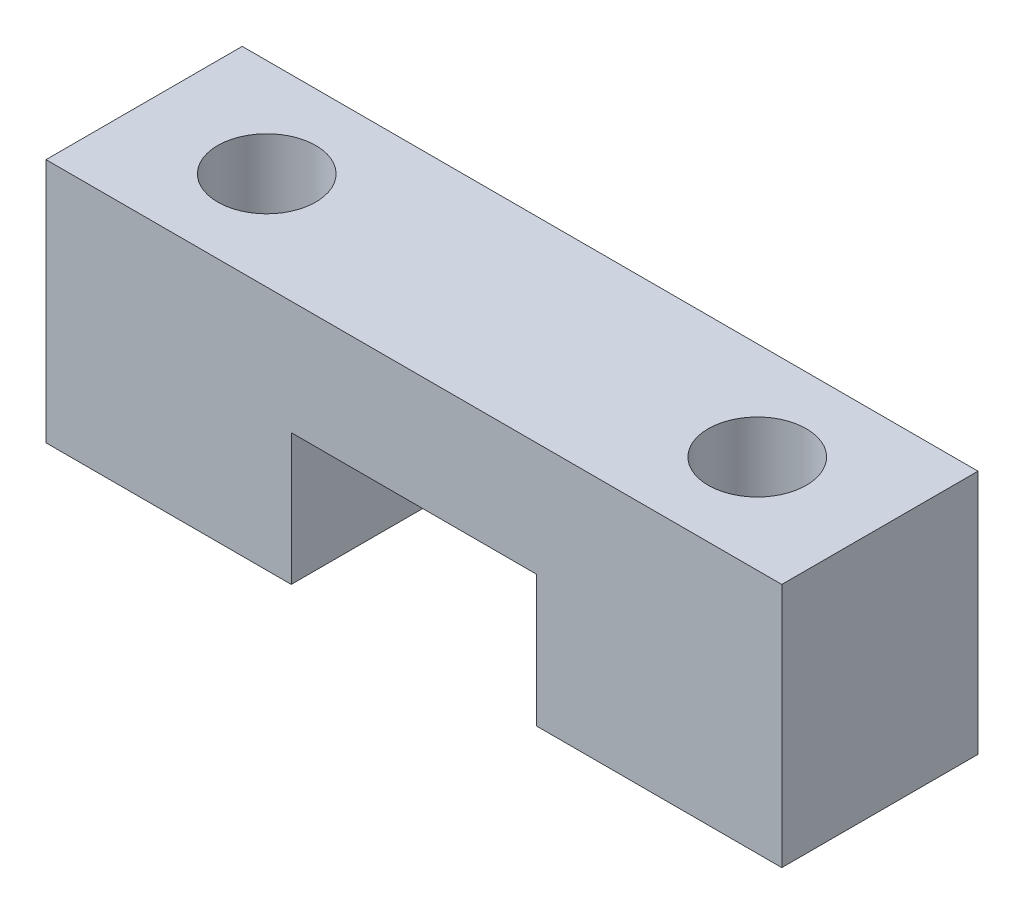
ISO-10303-21;
HEADER;
FILE_DESCRIPTION(('STEP AP214'),'2;1');
FILE_NAME('part.step','',(''),(''),'','','');
FILE_SCHEMA(('AUTOMOTIVE_DESIGN { 1 0 10303 214 1 1 1 1 }'));
ENDSEC;
DATA;
#1=APPLICATION_CONTEXT('core data for automotive mechanical design processes');
#2=APPLICATION_PROTOCOL_DEFINITION('international standard','automotive_design',2000,#1);
#3=PRODUCT_CONTEXT('',#1,'mechanical');
#4=PRODUCT('Part','Part','',(#3));
#5=PRODUCT_RELATED_PRODUCT_CATEGORY('part','',(#4));
#6=PRODUCT_DEFINITION_FORMATION('','',#4);
#7=PRODUCT_DEFINITION_CONTEXT('part definition',#1,'design');
#8=PRODUCT_DEFINITION('design','',#6,#7);
#9=PRODUCT_DEFINITION_SHAPE('','',#8);
#10=(LENGTH_UNIT() NAMED_UNIT(*) SI_UNIT(.MILLI.,.METRE.));
#11=(NAMED_UNIT(*) PLANE_ANGLE_UNIT() SI_UNIT($,.RADIAN.));
#12=(NAMED_UNIT(*) SI_UNIT($,.STERADIAN.) SOLID_ANGLE_UNIT());
#13=UNCERTAINTY_MEASURE_WITH_UNIT(LENGTH_MEASURE(1.E-05),#10,'distance_accuracy_value','');
#14=(GEOMETRIC_REPRESENTATION_CONTEXT(3) GLOBAL_UNCERTAINTY_ASSIGNED_CONTEXT((#13)) GLOBAL_UNIT_ASSIGNED_CONTEXT((#10,
#11,#12)) REPRESENTATION_CONTEXT('',''));
#15=CARTESIAN_POINT('',(0.,0.,0.));
#16=DIRECTION('',(0.,0.,1.));
#17=DIRECTION('',(1.,0.,0.));
#18=AXIS2_PLACEMENT_3D('',#15,#16,#17);
#19=CARTESIAN_POINT('',(0.,6.35,5.08));
#20=DIRECTION('',(1.,0.,0.));
#21=DIRECTION('',(0.,0.,-1.));
#22=AXIS2_PLACEMENT_3D('',#19,#20,#21);
#23=PLANE('',#22);
#24=DIRECTION('',(0.,-1.,0.));
#25=VECTOR('',#24,1.);
#26=CARTESIAN_POINT('',(0.,6.35,0.));
#27=LINE('',#26,#25);
#28=CARTESIAN_POINT('',(0.,6.35,0.));
#29=VERTEX_POINT('',#28);
#30=CARTESIAN_POINT('',(0.,0.,0.));
#31=VERTEX_POINT('',#30);
#32=EDGE_CURVE('E140',#29,#31,#27,.T.);
#33=ORIENTED_EDGE('',*,*,#32,.T.);
#34=DIRECTION('',(0.,0.,-1.));
#35=VECTOR('',#34,1.);
#36=CARTESIAN_POINT('',(0.,0.,5.08));
#37=LINE('',#36,#35);
#38=CARTESIAN_POINT('',(0.,0.,5.08));
#39=VERTEX_POINT('',#38);
#40=EDGE_CURVE('E11',#39,#31,#37,.T.);
#41=ORIENTED_EDGE('',*,*,#40,.F.);
#42=DIRECTION('',(0.,-1.,0.));
#43=VECTOR('',#42,1.);
#44=CARTESIAN_POINT('',(0.,6.35,5.08));
#45=LINE('',#44,#43);
#46=CARTESIAN_POINT('',(0.,6.35,5.08));
#47=VERTEX_POINT('',#46);
#48=EDGE_CURVE('E163',#47,#39,#45,.T.);
#49=ORIENTED_EDGE('',*,*,#48,.F.);
#50=DIRECTION('',(0.,0.,-1.));
#51=VECTOR('',#50,1.);
#52=CARTESIAN_POINT('',(0.,6.35,5.08));
#53=LINE('',#52,#51);
#54=EDGE_CURVE('E136',#47,#29,#53,.T.);
#55=ORIENTED_EDGE('',*,*,#54,.T.);
#56=EDGE_LOOP('',(#33,#41,#49,#55));
#57=FACE_BOUND('',#56,.T.);
#58=ADVANCED_FACE('F39',(#57),#23,.F.);
#59=CARTESIAN_POINT('',(0.,0.,5.08));
#60=DIRECTION('',(0.,1.,0.));
#61=DIRECTION('',(0.,0.,1.));
#62=AXIS2_PLACEMENT_3D('',#59,#60,#61);
#63=PLANE('',#62);
#64=CARTESIAN_POINT('',(3.175,0.,2.54));
#65=DIRECTION('',(0.,1.,0.));
#66=DIRECTION('',(-1.,0.,0.));
#67=AXIS2_PLACEMENT_3D('',#64,#65,#66);
#68=CIRCLE('',#67,1.27);
#69=CARTESIAN_POINT('',(1.905,0.,2.54));
#70=VERTEX_POINT('',#69);
#71=EDGE_CURVE('E145',#70,#70,#68,.T.);
#72=ORIENTED_EDGE('',*,*,#71,.T.);
#73=EDGE_LOOP('',(#72));
#74=FACE_BOUND('',#73,.T.);
#75=DIRECTION('',(1.,0.,0.));
#76=VECTOR('',#75,1.);
#77=CARTESIAN_POINT('',(0.,0.,0.));
#78=LINE('',#77,#76);
#79=CARTESIAN_POINT('',(6.35,0.,0.));
#80=VERTEX_POINT('',#79);
#81=EDGE_CURVE('E144',#31,#80,#78,.T.);
#82=ORIENTED_EDGE('',*,*,#81,.T.);
#83=DIRECTION('',(0.,0.,-1.));
#84=VECTOR('',#83,1.);
#85=CARTESIAN_POINT('',(6.35,0.,5.08));
#86=LINE('',#85,#84);
#87=CARTESIAN_POINT('',(6.35,0.,5.08));
#88=VERTEX_POINT('',#87);
#89=EDGE_CURVE('E48',#88,#80,#86,.T.);
#90=ORIENTED_EDGE('',*,*,#89,.F.);
#91=DIRECTION('',(1.,0.,0.));
#92=VECTOR('',#91,1.);
#93=CARTESIAN_POINT('',(0.,0.,5.08));
#94=LINE('',#93,#92);
#95=EDGE_CURVE('E99',#39,#88,#94,.T.);
#96=ORIENTED_EDGE('',*,*,#95,.F.);
#97=ORIENTED_EDGE('',*,*,#40,.T.);
#98=EDGE_LOOP('',(#82,#90,#96,#97));
#99=FACE_BOUND('',#98,.T.);
#100=ADVANCED_FACE('F223',(#74,#99),#63,.F.);
#101=CARTESIAN_POINT('',(6.35,0.,5.08));
#102=DIRECTION('',(-1.,0.,0.));
#103=DIRECTION('',(0.,-1.,0.));
#104=AXIS2_PLACEMENT_3D('',#101,#102,#103);
#105=PLANE('',#104);
#106=DIRECTION('',(0.,1.,0.));
#107=VECTOR('',#106,1.);
#108=CARTESIAN_POINT('',(6.35,0.,0.));
#109=LINE('',#108,#107);
#110=CARTESIAN_POINT('',(6.35,3.4036,0.));
#111=VERTEX_POINT('',#110);
#112=EDGE_CURVE('E148',#80,#111,#109,.T.);
#113=ORIENTED_EDGE('',*,*,#112,.T.);
#114=DIRECTION('',(0.,0.,-1.));
#115=VECTOR('',#114,1.);
#116=CARTESIAN_POINT('',(6.35,3.4036,5.08));
#117=LINE('',#116,#115);
#118=CARTESIAN_POINT('',(6.35,3.4036,5.08));
#119=VERTEX_POINT('',#118);
#120=EDGE_CURVE('E174',#119,#111,#117,.T.);
#121=ORIENTED_EDGE('',*,*,#120,.F.);
#122=DIRECTION('',(0.,1.,0.));
#123=VECTOR('',#122,1.);
#124=CARTESIAN_POINT('',(6.35,0.,5.08));
#125=LINE('',#124,#123);
#126=EDGE_CURVE('E184',#88,#119,#125,.T.);
#127=ORIENTED_EDGE('',*,*,#126,.F.);
#128=ORIENTED_EDGE('',*,*,#89,.T.);
#129=EDGE_LOOP('',(#113,#121,#127,#128));
#130=FACE_BOUND('',#129,.T.);
#131=ADVANCED_FACE('F182',(#130),#105,.F.);
#132=CARTESIAN_POINT('',(6.35,3.4036,5.08));
#133=DIRECTION('',(0.,1.,0.));
#134=DIRECTION('',(0.,0.,1.));
#135=AXIS2_PLACEMENT_3D('',#132,#133,#134);
#136=PLANE('',#135);
#137=DIRECTION('',(1.,0.,0.));
#138=VECTOR('',#137,1.);
#139=CARTESIAN_POINT('',(6.35,3.4036,0.));
#140=LINE('',#139,#138);
#141=CARTESIAN_POINT('',(12.7,3.4036,0.));
#142=VERTEX_POINT('',#141);
#143=EDGE_CURVE('E151',#111,#142,#140,.T.);
#144=ORIENTED_EDGE('',*,*,#143,.T.);
#145=DIRECTION('',(0.,0.,-1.));
#146=VECTOR('',#145,1.);
#147=CARTESIAN_POINT('',(12.7,3.4036,5.08));
#148=LINE('',#147,#146);
#149=CARTESIAN_POINT('',(12.7,3.4036,5.08));
#150=VERTEX_POINT('',#149);
#151=EDGE_CURVE('E170',#150,#142,#148,.T.);
#152=ORIENTED_EDGE('',*,*,#151,.F.);
#153=DIRECTION('',(1.,0.,0.));
#154=VECTOR('',#153,1.);
#155=CARTESIAN_POINT('',(6.35,3.4036,5.08));
#156=LINE('',#155,#154);
#157=EDGE_CURVE('E197',#119,#150,#156,.T.);
#158=ORIENTED_EDGE('',*,*,#157,.F.);
#159=ORIENTED_EDGE('',*,*,#120,.T.);
#160=EDGE_LOOP('',(#144,#152,#158,#159));
#161=FACE_BOUND('',#160,.T.);
#162=ADVANCED_FACE('F192',(#161),#136,.F.);
#163=CARTESIAN_POINT('',(12.7,3.4036,5.08));
#164=DIRECTION('',(1.,0.,0.));
#165=DIRECTION('',(0.,0.,-1.));
#166=AXIS2_PLACEMENT_3D('',#163,#164,#165);
#167=PLANE('',#166);
#168=DIRECTION('',(0.,-1.,0.));
#169=VECTOR('',#168,1.);
#170=CARTESIAN_POINT('',(12.7,3.4036,0.));
#171=LINE('',#170,#169);
#172=CARTESIAN_POINT('',(12.7,0.,0.));
#173=VERTEX_POINT('',#172);
#174=EDGE_CURVE('E154',#142,#173,#171,.T.);
#175=ORIENTED_EDGE('',*,*,#174,.T.);
#176=DIRECTION('',(0.,0.,-1.));
#177=VECTOR('',#176,1.);
#178=CARTESIAN_POINT('',(12.7,0.,5.08));
#179=LINE('',#178,#177);
#180=CARTESIAN_POINT('',(12.7,0.,5.08));
#181=VERTEX_POINT('',#180);
#182=EDGE_CURVE('E129',#181,#173,#179,.T.);
#183=ORIENTED_EDGE('',*,*,#182,.F.);
#184=DIRECTION('',(0.,-1.,0.));
#185=VECTOR('',#184,1.);
#186=CARTESIAN_POINT('',(12.7,3.4036,5.08));
#187=LINE('',#186,#185);
#188=EDGE_CURVE('E118',#150,#181,#187,.T.);
#189=ORIENTED_EDGE('',*,*,#188,.F.);
#190=ORIENTED_EDGE('',*,*,#151,.T.);
#191=EDGE_LOOP('',(#175,#183,#189,#190));
#192=FACE_BOUND('',#191,.T.);
#193=ADVANCED_FACE('F195',(#192),#167,.F.);
#194=CARTESIAN_POINT('',(12.7,0.,5.08));
#195=DIRECTION('',(0.,1.,0.));
#196=DIRECTION('',(0.,0.,1.));
#197=AXIS2_PLACEMENT_3D('',#194,#195,#196);
#198=PLANE('',#197);
#199=CARTESIAN_POINT('',(15.875,0.,2.54));
#200=DIRECTION('',(0.,1.,0.));
#201=DIRECTION('',(-1.,0.,0.));
#202=AXIS2_PLACEMENT_3D('',#199,#200,#201);
#203=CIRCLE('',#202,1.27);
#204=CARTESIAN_POINT('',(14.605,0.,2.54));
#205=VERTEX_POINT('',#204);
#206=EDGE_CURVE('E207',#205,#205,#203,.T.);
#207=ORIENTED_EDGE('',*,*,#206,.T.);
#208=EDGE_LOOP('',(#207));
#209=FACE_BOUND('',#208,.T.);
#210=DIRECTION('',(1.,0.,0.));
#211=VECTOR('',#210,1.);
#212=CARTESIAN_POINT('',(12.7,0.,0.));
#213=LINE('',#212,#211);
#214=CARTESIAN_POINT('',(19.05,0.,0.));
#215=VERTEX_POINT('',#214);
#216=EDGE_CURVE('E127',#173,#215,#213,.T.);
#217=ORIENTED_EDGE('',*,*,#216,.T.);
#218=DIRECTION('',(0.,0.,-1.));
#219=VECTOR('',#218,1.);
#220=CARTESIAN_POINT('',(19.05,0.,5.08));
#221=LINE('',#220,#219);
#222=CARTESIAN_POINT('',(19.05,0.,5.08));
#223=VERTEX_POINT('',#222);
#224=EDGE_CURVE('E124',#223,#215,#221,.T.);
#225=ORIENTED_EDGE('',*,*,#224,.F.);
#226=DIRECTION('',(1.,0.,0.));
#227=VECTOR('',#226,1.);
#228=CARTESIAN_POINT('',(12.7,0.,5.08));
#229=LINE('',#228,#227);
#230=EDGE_CURVE('E112',#181,#223,#229,.T.);
#231=ORIENTED_EDGE('',*,*,#230,.F.);
#232=ORIENTED_EDGE('',*,*,#182,.T.);
#233=EDGE_LOOP('',(#217,#225,#231,#232));
#234=FACE_BOUND('',#233,.T.);
#235=ADVANCED_FACE('F125',(#209,#234),#198,.F.);
#236=CARTESIAN_POINT('',(19.05,0.,5.08));
#237=DIRECTION('',(-1.,0.,0.));
#238=DIRECTION('',(0.,-1.,0.));
#239=AXIS2_PLACEMENT_3D('',#236,#237,#238);
#240=PLANE('',#239);
#241=DIRECTION('',(0.,1.,0.));
#242=VECTOR('',#241,1.);
#243=CARTESIAN_POINT('',(19.05,0.,0.));
#244=LINE('',#243,#242);
#245=CARTESIAN_POINT('',(19.05,6.35,0.));
#246=VERTEX_POINT('',#245);
#247=EDGE_CURVE('E85',#215,#246,#244,.T.);
#248=ORIENTED_EDGE('',*,*,#247,.T.);
#249=DIRECTION('',(0.,0.,-1.));
#250=VECTOR('',#249,1.);
#251=CARTESIAN_POINT('',(19.05,6.35,5.08));
#252=LINE('',#251,#250);
#253=CARTESIAN_POINT('',(19.05,6.35,5.08));
#254=VERTEX_POINT('',#253);
#255=EDGE_CURVE('E130',#254,#246,#252,.T.);
#256=ORIENTED_EDGE('',*,*,#255,.F.);
#257=DIRECTION('',(0.,1.,0.));
#258=VECTOR('',#257,1.);
#259=CARTESIAN_POINT('',(19.05,0.,5.08));
#260=LINE('',#259,#258);
#261=EDGE_CURVE('E116',#223,#254,#260,.T.);
#262=ORIENTED_EDGE('',*,*,#261,.F.);
#263=ORIENTED_EDGE('',*,*,#224,.T.);
#264=EDGE_LOOP('',(#248,#256,#262,#263));
#265=FACE_BOUND('',#264,.T.);
#266=ADVANCED_FACE('F132',(#265),#240,.F.);
#267=CARTESIAN_POINT('',(19.05,6.35,5.08));
#268=DIRECTION('',(0.,-1.,0.));
#269=DIRECTION('',(1.,0.,0.));
#270=AXIS2_PLACEMENT_3D('',#267,#268,#269);
#271=PLANE('',#270);
#272=CARTESIAN_POINT('',(3.175,6.35,2.54));
#273=DIRECTION('',(0.,1.,0.));
#274=DIRECTION('',(-1.,0.,0.));
#275=AXIS2_PLACEMENT_3D('',#272,#273,#274);
#276=CIRCLE('',#275,1.27);
#277=CARTESIAN_POINT('',(1.905,6.35,2.54));
#278=VERTEX_POINT('',#277);
#279=EDGE_CURVE('E215',#278,#278,#276,.T.);
#280=ORIENTED_EDGE('',*,*,#279,.F.);
#281=EDGE_LOOP('',(#280));
#282=FACE_BOUND('',#281,.T.);
#283=CARTESIAN_POINT('',(15.875,6.35,2.54));
#284=DIRECTION('',(0.,1.,0.));
#285=DIRECTION('',(-1.,0.,0.));
#286=AXIS2_PLACEMENT_3D('',#283,#284,#285);
#287=CIRCLE('',#286,1.27);
#288=CARTESIAN_POINT('',(14.605,6.35,2.54));
#289=VERTEX_POINT('',#288);
#290=EDGE_CURVE('E211',#289,#289,#287,.T.);
#291=ORIENTED_EDGE('',*,*,#290,.F.);
#292=EDGE_LOOP('',(#291));
#293=FACE_BOUND('',#292,.T.);
#294=DIRECTION('',(-1.,0.,0.));
#295=VECTOR('',#294,1.);
#296=CARTESIAN_POINT('',(19.05,6.35,0.));
#297=LINE('',#296,#295);
#298=EDGE_CURVE('E91',#246,#29,#297,.T.);
#299=ORIENTED_EDGE('',*,*,#298,.T.);
#300=ORIENTED_EDGE('',*,*,#54,.F.);
#301=DIRECTION('',(-1.,0.,0.));
#302=VECTOR('',#301,1.);
#303=CARTESIAN_POINT('',(19.05,6.35,5.08));
#304=LINE('',#303,#302);
#305=EDGE_CURVE('E56',#254,#47,#304,.T.);
#306=ORIENTED_EDGE('',*,*,#305,.F.);
#307=ORIENTED_EDGE('',*,*,#255,.T.);
#308=EDGE_LOOP('',(#299,#300,#306,#307));
#309=FACE_BOUND('',#308,.T.);
#310=ADVANCED_FACE('F232',(#282,#293,#309),#271,.F.);
#311=CARTESIAN_POINT('',(0.,0.,5.08));
#312=DIRECTION('',(0.,0.,1.));
#313=DIRECTION('',(1.,0.,0.));
#314=AXIS2_PLACEMENT_3D('',#311,#312,#313);
#315=PLANE('',#314);
#316=ORIENTED_EDGE('',*,*,#48,.T.);
#317=ORIENTED_EDGE('',*,*,#95,.T.);
#318=ORIENTED_EDGE('',*,*,#126,.T.);
#319=ORIENTED_EDGE('',*,*,#157,.T.);
#320=ORIENTED_EDGE('',*,*,#188,.T.);
#321=ORIENTED_EDGE('',*,*,#230,.T.);
#322=ORIENTED_EDGE('',*,*,#261,.T.);
#323=ORIENTED_EDGE('',*,*,#305,.T.);
#324=EDGE_LOOP('',(#316,#317,#318,#319,#320,#321,#322,#323));
#325=FACE_BOUND('',#324,.T.);
#326=ADVANCED_FACE('F114',(#325),#315,.T.);
#327=CARTESIAN_POINT('',(0.,0.,0.));
#328=DIRECTION('',(0.,0.,1.));
#329=DIRECTION('',(1.,0.,0.));
#330=AXIS2_PLACEMENT_3D('',#327,#328,#329);
#331=PLANE('',#330);
#332=ORIENTED_EDGE('',*,*,#32,.F.);
#333=ORIENTED_EDGE('',*,*,#298,.F.);
#334=ORIENTED_EDGE('',*,*,#247,.F.);
#335=ORIENTED_EDGE('',*,*,#216,.F.);
#336=ORIENTED_EDGE('',*,*,#174,.F.);
#337=ORIENTED_EDGE('',*,*,#143,.F.);
#338=ORIENTED_EDGE('',*,*,#112,.F.);
#339=ORIENTED_EDGE('',*,*,#81,.F.);
#340=EDGE_LOOP('',(#332,#333,#334,#335,#336,#337,#338,#339));
#341=FACE_BOUND('',#340,.T.);
#342=ADVANCED_FACE('F188',(#341),#331,.F.);
#343=CARTESIAN_POINT('',(15.875,0.,2.54));
#344=DIRECTION('',(0.,1.,0.));
#345=DIRECTION('',(-1.,0.,0.));
#346=AXIS2_PLACEMENT_3D('',#343,#344,#345);
#347=CYLINDRICAL_SURFACE('',#346,1.27);
#348=ORIENTED_EDGE('',*,*,#206,.F.);
#349=EDGE_LOOP('',(#348));
#350=FACE_BOUND('',#349,.T.);
#351=ORIENTED_EDGE('',*,*,#290,.T.);
#352=EDGE_LOOP('',(#351));
#353=FACE_BOUND('',#352,.T.);
#354=ADVANCED_FACE('F228',(#350,#353),#347,.F.);
#355=CARTESIAN_POINT('',(3.175,0.,2.54));
#356=DIRECTION('',(0.,1.,0.));
#357=DIRECTION('',(-1.,0.,0.));
#358=AXIS2_PLACEMENT_3D('',#355,#356,#357);
#359=CYLINDRICAL_SURFACE('',#358,1.27);
#360=ORIENTED_EDGE('',*,*,#71,.F.);
#361=EDGE_LOOP('',(#360));
#362=FACE_BOUND('',#361,.T.);
#363=ORIENTED_EDGE('',*,*,#279,.T.);
#364=EDGE_LOOP('',(#363));
#365=FACE_BOUND('',#364,.T.);
#366=ADVANCED_FACE('F225',(#362,#365),#359,.F.);
#367=CLOSED_SHELL('',(#58,#100,#131,#162,#193,#235,#266,#310,#326,#342,#354,#366));
#368=MANIFOLD_SOLID_BREP('B2',#367);
#369=ADVANCED_BREP_SHAPE_REPRESENTATION('',(#18,#368),#14);
#370=SHAPE_DEFINITION_REPRESENTATION(#9,#369);
ENDSEC;
END-ISO-10303-21;
